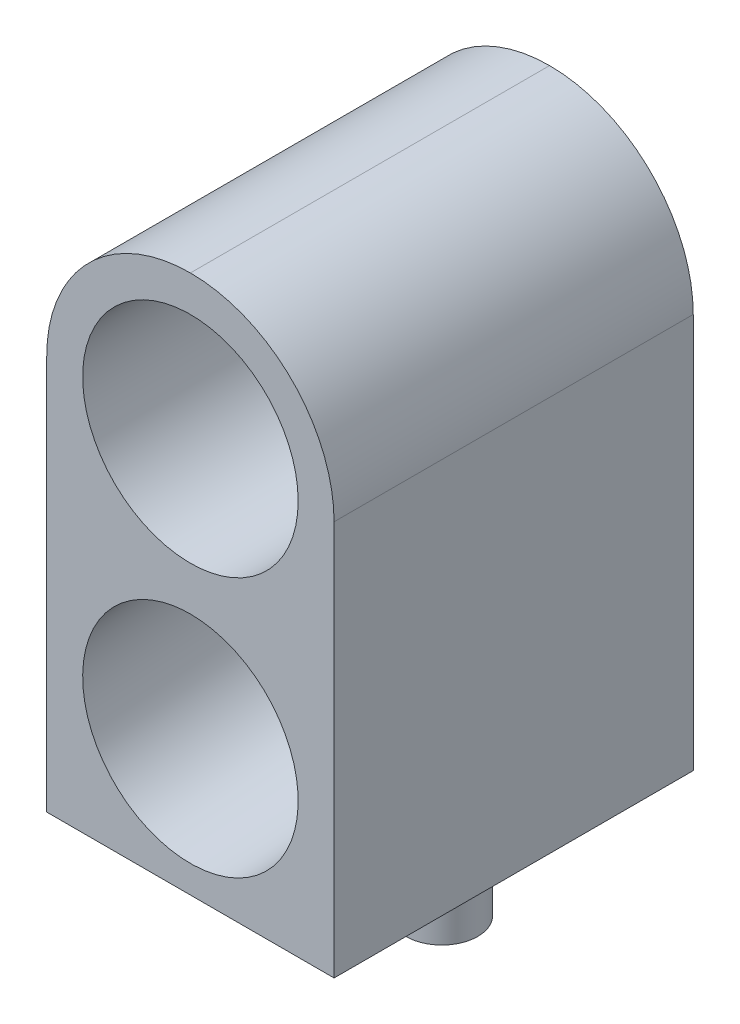
ISO-10303-21;
HEADER;
FILE_DESCRIPTION(('STEP AP214'),'2;1');
FILE_NAME('part.step','',(''),(''),'','','');
FILE_SCHEMA(('AUTOMOTIVE_DESIGN { 1 0 10303 214 1 1 1 1 }'));
ENDSEC;
DATA;
#1=APPLICATION_CONTEXT('core data for automotive mechanical design processes');
#2=APPLICATION_PROTOCOL_DEFINITION('international standard','automotive_design',2000,#1);
#3=PRODUCT_CONTEXT('',#1,'mechanical');
#4=PRODUCT('Part','Part','',(#3));
#5=PRODUCT_RELATED_PRODUCT_CATEGORY('part','',(#4));
#6=PRODUCT_DEFINITION_FORMATION('','',#4);
#7=PRODUCT_DEFINITION_CONTEXT('part definition',#1,'design');
#8=PRODUCT_DEFINITION('design','',#6,#7);
#9=PRODUCT_DEFINITION_SHAPE('','',#8);
#10=(LENGTH_UNIT() NAMED_UNIT(*) SI_UNIT(.MILLI.,.METRE.));
#11=(NAMED_UNIT(*) PLANE_ANGLE_UNIT() SI_UNIT($,.RADIAN.));
#12=(NAMED_UNIT(*) SI_UNIT($,.STERADIAN.) SOLID_ANGLE_UNIT());
#13=UNCERTAINTY_MEASURE_WITH_UNIT(LENGTH_MEASURE(1.E-05),#10,'distance_accuracy_value','');
#14=(GEOMETRIC_REPRESENTATION_CONTEXT(3) GLOBAL_UNCERTAINTY_ASSIGNED_CONTEXT((#13)) GLOBAL_UNIT_ASSIGNED_CONTEXT((#10,
#11,#12)) REPRESENTATION_CONTEXT('',''));
#15=CARTESIAN_POINT('',(0.,0.,0.));
#16=DIRECTION('',(0.,0.,1.));
#17=DIRECTION('',(1.,0.,0.));
#18=AXIS2_PLACEMENT_3D('',#15,#16,#17);
#19=CARTESIAN_POINT('',(3.99999999999999,-7.49999999999999,10.));
#20=DIRECTION('',(-1.,0.,0.));
#21=DIRECTION('',(0.,0.,1.));
#22=AXIS2_PLACEMENT_3D('',#19,#20,#21);
#23=PLANE('',#22);
#24=DIRECTION('',(0.,1.,0.));
#25=VECTOR('',#24,1.);
#26=CARTESIAN_POINT('',(3.99999999999999,-7.49999999999999,0.));
#27=LINE('',#26,#25);
#28=CARTESIAN_POINT('',(3.99999999999999,-7.49999999999999,0.));
#29=VERTEX_POINT('',#28);
#30=CARTESIAN_POINT('',(3.99999999999999,3.50000000000001,0.));
#31=VERTEX_POINT('',#30);
#32=EDGE_CURVE('E109',#29,#31,#27,.T.);
#33=ORIENTED_EDGE('',*,*,#32,.T.);
#34=DIRECTION('',(0.,0.,-1.));
#35=VECTOR('',#34,1.);
#36=CARTESIAN_POINT('',(3.99999999999999,3.50000000000001,10.));
#37=LINE('',#36,#35);
#38=CARTESIAN_POINT('',(3.99999999999999,3.50000000000001,10.));
#39=VERTEX_POINT('',#38);
#40=EDGE_CURVE('E119',#31,#39,#37,.F.);
#41=ORIENTED_EDGE('',*,*,#40,.T.);
#42=DIRECTION('',(0.,1.,0.));
#43=VECTOR('',#42,1.);
#44=CARTESIAN_POINT('',(3.99999999999999,-7.49999999999999,10.));
#45=LINE('',#44,#43);
#46=CARTESIAN_POINT('',(3.99999999999999,-7.49999999999999,10.));
#47=VERTEX_POINT('',#46);
#48=EDGE_CURVE('E90',#47,#39,#45,.T.);
#49=ORIENTED_EDGE('',*,*,#48,.F.);
#50=DIRECTION('',(0.,0.,-1.));
#51=VECTOR('',#50,1.);
#52=CARTESIAN_POINT('',(3.99999999999999,-7.49999999999999,10.));
#53=LINE('',#52,#51);
#54=EDGE_CURVE('E100',#47,#29,#53,.T.);
#55=ORIENTED_EDGE('',*,*,#54,.T.);
#56=EDGE_LOOP('',(#33,#41,#49,#55));
#57=FACE_BOUND('',#56,.T.);
#58=ADVANCED_FACE('F38',(#57),#23,.F.);
#59=CARTESIAN_POINT('',(-4.,-7.49999999999999,10.));
#60=DIRECTION('',(1.,0.,0.));
#61=DIRECTION('',(0.,0.,-1.));
#62=AXIS2_PLACEMENT_3D('',#59,#60,#61);
#63=PLANE('',#62);
#64=DIRECTION('',(0.,-1.,0.));
#65=VECTOR('',#64,1.);
#66=CARTESIAN_POINT('',(-4.,-7.49999999999999,10.));
#67=LINE('',#66,#65);
#68=CARTESIAN_POINT('',(-4.,3.50000000000001,10.));
#69=VERTEX_POINT('',#68);
#70=CARTESIAN_POINT('',(-4.,-7.49999999999999,10.));
#71=VERTEX_POINT('',#70);
#72=EDGE_CURVE('E82',#69,#71,#67,.T.);
#73=ORIENTED_EDGE('',*,*,#72,.F.);
#74=DIRECTION('',(0.,0.,-1.));
#75=VECTOR('',#74,1.);
#76=CARTESIAN_POINT('',(-4.,3.50000000000001,10.));
#77=LINE('',#76,#75);
#78=CARTESIAN_POINT('',(-4.,3.50000000000001,0.));
#79=VERTEX_POINT('',#78);
#80=EDGE_CURVE('E124',#69,#79,#77,.T.);
#81=ORIENTED_EDGE('',*,*,#80,.T.);
#82=DIRECTION('',(0.,-1.,0.));
#83=VECTOR('',#82,1.);
#84=CARTESIAN_POINT('',(-4.,-7.49999999999999,0.));
#85=LINE('',#84,#83);
#86=CARTESIAN_POINT('',(-4.,-7.49999999999999,0.));
#87=VERTEX_POINT('',#86);
#88=EDGE_CURVE('E96',#79,#87,#85,.T.);
#89=ORIENTED_EDGE('',*,*,#88,.T.);
#90=DIRECTION('',(0.,0.,-1.));
#91=VECTOR('',#90,1.);
#92=CARTESIAN_POINT('',(-4.,-7.49999999999999,10.));
#93=LINE('',#92,#91);
#94=EDGE_CURVE('E93',#71,#87,#93,.T.);
#95=ORIENTED_EDGE('',*,*,#94,.F.);
#96=EDGE_LOOP('',(#73,#81,#89,#95));
#97=FACE_BOUND('',#96,.T.);
#98=ADVANCED_FACE('F94',(#97),#63,.F.);
#99=CARTESIAN_POINT('',(-4.,-7.49999999999999,10.));
#100=DIRECTION('',(0.,1.,0.));
#101=DIRECTION('',(0.,0.,1.));
#102=AXIS2_PLACEMENT_3D('',#99,#100,#101);
#103=PLANE('',#102);
#104=CARTESIAN_POINT('',(1.99999999999999,-7.49999999999999,5.));
#105=DIRECTION('',(0.,1.,0.));
#106=DIRECTION('',(0.,0.,1.));
#107=AXIS2_PLACEMENT_3D('',#104,#105,#106);
#108=CIRCLE('',#107,1.);
#109=CARTESIAN_POINT('',(1.99999999999999,-7.49999999999999,6.));
#110=VERTEX_POINT('',#109);
#111=EDGE_CURVE('E11',#110,#110,#108,.F.);
#112=ORIENTED_EDGE('',*,*,#111,.F.);
#113=EDGE_LOOP('',(#112));
#114=FACE_BOUND('',#113,.T.);
#115=CARTESIAN_POINT('',(-2.,-7.49999999999999,5.));
#116=DIRECTION('',(0.,1.,0.));
#117=DIRECTION('',(0.,0.,1.));
#118=AXIS2_PLACEMENT_3D('',#115,#116,#117);
#119=CIRCLE('',#118,1.);
#120=CARTESIAN_POINT('',(-2.,-7.49999999999999,6.));
#121=VERTEX_POINT('',#120);
#122=EDGE_CURVE('E47',#121,#121,#119,.F.);
#123=ORIENTED_EDGE('',*,*,#122,.F.);
#124=EDGE_LOOP('',(#123));
#125=FACE_BOUND('',#124,.T.);
#126=DIRECTION('',(1.,0.,0.));
#127=VECTOR('',#126,1.);
#128=CARTESIAN_POINT('',(-4.,-7.49999999999999,0.));
#129=LINE('',#128,#127);
#130=EDGE_CURVE('E114',#87,#29,#129,.T.);
#131=ORIENTED_EDGE('',*,*,#130,.T.);
#132=ORIENTED_EDGE('',*,*,#54,.F.);
#133=DIRECTION('',(1.,0.,0.));
#134=VECTOR('',#133,1.);
#135=CARTESIAN_POINT('',(-4.,-7.49999999999999,10.));
#136=LINE('',#135,#134);
#137=EDGE_CURVE('E86',#71,#47,#136,.T.);
#138=ORIENTED_EDGE('',*,*,#137,.F.);
#139=ORIENTED_EDGE('',*,*,#94,.T.);
#140=EDGE_LOOP('',(#131,#132,#138,#139));
#141=FACE_BOUND('',#140,.T.);
#142=ADVANCED_FACE('F102',(#114,#125,#141),#103,.F.);
#143=CARTESIAN_POINT('',(0.,0.,10.));
#144=DIRECTION('',(0.,0.,-1.));
#145=DIRECTION('',(-1.,0.,0.));
#146=AXIS2_PLACEMENT_3D('',#143,#144,#145);
#147=PLANE('',#146);
#148=CARTESIAN_POINT('',(0.,-3.73075847941358,10.));
#149=DIRECTION('',(0.,0.,-1.));
#150=DIRECTION('',(0.,1.,0.));
#151=AXIS2_PLACEMENT_3D('',#148,#149,#150);
#152=ELLIPSE('',#151,3.00732569424352,3.);
#153=CARTESIAN_POINT('',(0.,-0.723432785170062,10.));
#154=VERTEX_POINT('',#153);
#155=EDGE_CURVE('E139',#154,#154,#152,.F.);
#156=ORIENTED_EDGE('',*,*,#155,.F.);
#157=EDGE_LOOP('',(#156));
#158=FACE_BOUND('',#157,.T.);
#159=CARTESIAN_POINT('',(0.,3.50000000000001,10.));
#160=DIRECTION('',(0.,0.,1.));
#161=DIRECTION('',(1.,0.,0.));
#162=AXIS2_PLACEMENT_3D('',#159,#160,#161);
#163=CIRCLE('',#162,3.);
#164=CARTESIAN_POINT('',(3.,3.50000000000001,10.));
#165=VERTEX_POINT('',#164);
#166=EDGE_CURVE('E133',#165,#165,#163,.T.);
#167=ORIENTED_EDGE('',*,*,#166,.F.);
#168=EDGE_LOOP('',(#167));
#169=FACE_BOUND('',#168,.T.);
#170=ORIENTED_EDGE('',*,*,#48,.T.);
#171=CARTESIAN_POINT('',(0.,3.50000000000001,10.));
#172=DIRECTION('',(0.,0.,-1.));
#173=DIRECTION('',(-1.,0.,0.));
#174=AXIS2_PLACEMENT_3D('',#171,#172,#173);
#175=CIRCLE('',#174,4.);
#176=CARTESIAN_POINT('',(0.,7.50000000000001,10.));
#177=VERTEX_POINT('',#176);
#178=EDGE_CURVE('E60',#39,#177,#175,.F.);
#179=ORIENTED_EDGE('',*,*,#178,.T.);
#180=CARTESIAN_POINT('',(0.,3.50000000000001,10.));
#181=DIRECTION('',(0.,0.,-1.));
#182=DIRECTION('',(-1.,0.,0.));
#183=AXIS2_PLACEMENT_3D('',#180,#181,#182);
#184=CIRCLE('',#183,4.);
#185=EDGE_CURVE('E55',#177,#69,#184,.F.);
#186=ORIENTED_EDGE('',*,*,#185,.T.);
#187=ORIENTED_EDGE('',*,*,#72,.T.);
#188=ORIENTED_EDGE('',*,*,#137,.T.);
#189=EDGE_LOOP('',(#170,#179,#186,#187,#188));
#190=FACE_BOUND('',#189,.T.);
#191=ADVANCED_FACE('F84',(#158,#169,#190),#147,.F.);
#192=CARTESIAN_POINT('',(0.,0.,0.));
#193=DIRECTION('',(0.,0.,-1.));
#194=DIRECTION('',(-1.,0.,0.));
#195=AXIS2_PLACEMENT_3D('',#192,#193,#194);
#196=PLANE('',#195);
#197=CARTESIAN_POINT('',(0.,-3.03149035997847,0.));
#198=DIRECTION('',(0.,0.,-1.));
#199=DIRECTION('',(0.,1.,0.));
#200=AXIS2_PLACEMENT_3D('',#197,#198,#199);
#201=ELLIPSE('',#200,3.00732569424352,3.);
#202=CARTESIAN_POINT('',(0.,-0.0241646657349534,0.));
#203=VERTEX_POINT('',#202);
#204=EDGE_CURVE('E42',#203,#203,#201,.F.);
#205=ORIENTED_EDGE('',*,*,#204,.T.);
#206=EDGE_LOOP('',(#205));
#207=FACE_BOUND('',#206,.T.);
#208=CARTESIAN_POINT('',(0.,3.50000000000001,0.));
#209=DIRECTION('',(0.,0.,-1.));
#210=DIRECTION('',(-1.,0.,0.));
#211=AXIS2_PLACEMENT_3D('',#208,#209,#210);
#212=CIRCLE('',#211,3.);
#213=CARTESIAN_POINT('',(3.,3.50000000000001,0.));
#214=VERTEX_POINT('',#213);
#215=EDGE_CURVE('E130',#214,#214,#212,.T.);
#216=ORIENTED_EDGE('',*,*,#215,.F.);
#217=EDGE_LOOP('',(#216));
#218=FACE_BOUND('',#217,.T.);
#219=CARTESIAN_POINT('',(0.,3.50000000000001,0.));
#220=DIRECTION('',(0.,0.,-1.));
#221=DIRECTION('',(-1.,0.,0.));
#222=AXIS2_PLACEMENT_3D('',#219,#220,#221);
#223=CIRCLE('',#222,4.);
#224=CARTESIAN_POINT('',(0.,7.50000000000001,0.));
#225=VERTEX_POINT('',#224);
#226=EDGE_CURVE('E99',#79,#225,#223,.T.);
#227=ORIENTED_EDGE('',*,*,#226,.T.);
#228=CARTESIAN_POINT('',(0.,3.50000000000001,0.));
#229=DIRECTION('',(0.,0.,-1.));
#230=DIRECTION('',(-1.,0.,0.));
#231=AXIS2_PLACEMENT_3D('',#228,#229,#230);
#232=CIRCLE('',#231,4.);
#233=EDGE_CURVE('E117',#225,#31,#232,.T.);
#234=ORIENTED_EDGE('',*,*,#233,.T.);
#235=ORIENTED_EDGE('',*,*,#32,.F.);
#236=ORIENTED_EDGE('',*,*,#130,.F.);
#237=ORIENTED_EDGE('',*,*,#88,.F.);
#238=EDGE_LOOP('',(#227,#234,#235,#236,#237));
#239=FACE_BOUND('',#238,.T.);
#240=ADVANCED_FACE('F157',(#207,#218,#239),#196,.T.);
#241=CARTESIAN_POINT('',(0.,3.50000000000001,10.));
#242=DIRECTION('',(0.,0.,-1.));
#243=DIRECTION('',(-1.,0.,0.));
#244=AXIS2_PLACEMENT_3D('',#241,#242,#243);
#245=CYLINDRICAL_SURFACE('',#244,4.);
#246=ORIENTED_EDGE('',*,*,#80,.F.);
#247=ORIENTED_EDGE('',*,*,#185,.F.);
#248=DIRECTION('',(0.,0.,-1.));
#249=VECTOR('',#248,1.);
#250=CARTESIAN_POINT('',(0.,7.50000000000001,10.));
#251=LINE('',#250,#249);
#252=EDGE_CURVE('E112',#225,#177,#251,.F.);
#253=ORIENTED_EDGE('',*,*,#252,.F.);
#254=ORIENTED_EDGE('',*,*,#226,.F.);
#255=EDGE_LOOP('',(#246,#247,#253,#254));
#256=FACE_BOUND('',#255,.T.);
#257=ADVANCED_FACE('F40',(#256),#245,.T.);
#258=CARTESIAN_POINT('',(0.,3.50000000000001,10.));
#259=DIRECTION('',(0.,0.,-1.));
#260=DIRECTION('',(-1.,0.,0.));
#261=AXIS2_PLACEMENT_3D('',#258,#259,#260);
#262=CYLINDRICAL_SURFACE('',#261,4.);
#263=ORIENTED_EDGE('',*,*,#178,.F.);
#264=ORIENTED_EDGE('',*,*,#40,.F.);
#265=ORIENTED_EDGE('',*,*,#233,.F.);
#266=ORIENTED_EDGE('',*,*,#252,.T.);
#267=EDGE_LOOP('',(#263,#264,#265,#266));
#268=FACE_BOUND('',#267,.T.);
#269=ADVANCED_FACE('F152',(#268),#262,.T.);
#270=CARTESIAN_POINT('',(-2.,-9.49999999999999,5.));
#271=DIRECTION('',(0.,1.,0.));
#272=DIRECTION('',(0.,0.,1.));
#273=AXIS2_PLACEMENT_3D('',#270,#271,#272);
#274=CYLINDRICAL_SURFACE('',#273,1.);
#275=CARTESIAN_POINT('',(-2.,-9.49999999999999,5.));
#276=DIRECTION('',(0.,-1.,0.));
#277=DIRECTION('',(0.,0.,-1.));
#278=AXIS2_PLACEMENT_3D('',#275,#276,#277);
#279=CIRCLE('',#278,1.);
#280=CARTESIAN_POINT('',(-2.,-9.49999999999999,4.));
#281=VERTEX_POINT('',#280);
#282=EDGE_CURVE('E128',#281,#281,#279,.T.);
#283=ORIENTED_EDGE('',*,*,#282,.F.);
#284=EDGE_LOOP('',(#283));
#285=FACE_BOUND('',#284,.T.);
#286=ORIENTED_EDGE('',*,*,#122,.T.);
#287=EDGE_LOOP('',(#286));
#288=FACE_BOUND('',#287,.T.);
#289=ADVANCED_FACE('F177',(#285,#288),#274,.T.);
#290=CARTESIAN_POINT('',(-2.,-9.49999999999999,5.));
#291=DIRECTION('',(0.,-1.,0.));
#292=DIRECTION('',(0.,0.,-1.));
#293=AXIS2_PLACEMENT_3D('',#290,#291,#292);
#294=PLANE('',#293);
#295=ORIENTED_EDGE('',*,*,#282,.T.);
#296=EDGE_LOOP('',(#295));
#297=FACE_BOUND('',#296,.T.);
#298=ADVANCED_FACE('F181',(#297),#294,.T.);
#299=CARTESIAN_POINT('',(1.99999999999999,-9.49999999999999,5.));
#300=DIRECTION('',(0.,1.,0.));
#301=DIRECTION('',(0.,0.,1.));
#302=AXIS2_PLACEMENT_3D('',#299,#300,#301);
#303=CYLINDRICAL_SURFACE('',#302,1.);
#304=CARTESIAN_POINT('',(1.99999999999999,-9.49999999999999,5.));
#305=DIRECTION('',(0.,-1.,0.));
#306=DIRECTION('',(0.,0.,-1.));
#307=AXIS2_PLACEMENT_3D('',#304,#305,#306);
#308=CIRCLE('',#307,1.);
#309=CARTESIAN_POINT('',(1.99999999999999,-9.49999999999999,4.));
#310=VERTEX_POINT('',#309);
#311=EDGE_CURVE('E132',#310,#310,#308,.T.);
#312=ORIENTED_EDGE('',*,*,#311,.F.);
#313=EDGE_LOOP('',(#312));
#314=FACE_BOUND('',#313,.T.);
#315=ORIENTED_EDGE('',*,*,#111,.T.);
#316=EDGE_LOOP('',(#315));
#317=FACE_BOUND('',#316,.T.);
#318=ADVANCED_FACE('F187',(#314,#317),#303,.T.);
#319=CARTESIAN_POINT('',(1.99999999999999,-9.49999999999999,5.));
#320=DIRECTION('',(0.,-1.,0.));
#321=DIRECTION('',(0.,0.,-1.));
#322=AXIS2_PLACEMENT_3D('',#319,#320,#321);
#323=PLANE('',#322);
#324=ORIENTED_EDGE('',*,*,#311,.T.);
#325=EDGE_LOOP('',(#324));
#326=FACE_BOUND('',#325,.T.);
#327=ADVANCED_FACE('F195',(#326),#323,.T.);
#328=CARTESIAN_POINT('',(0.,3.50000000000001,-5.));
#329=DIRECTION('',(0.,0.,1.));
#330=DIRECTION('',(1.,0.,0.));
#331=AXIS2_PLACEMENT_3D('',#328,#329,#330);
#332=CYLINDRICAL_SURFACE('',#331,3.);
#333=CARTESIAN_POINT('',(3.,3.50000000000001,0.));
#334=CARTESIAN_POINT('',(3.,3.50000000000001,0.104166666666668));
#335=CARTESIAN_POINT('',(3.,3.50000000000001,0.208333333333334));
#336=CARTESIAN_POINT('',(3.,3.50000000000001,0.416666666666668));
#337=CARTESIAN_POINT('',(3.,3.50000000000001,0.520833333333334));
#338=CARTESIAN_POINT('',(3.,3.50000000000001,0.729166666666667));
#339=CARTESIAN_POINT('',(3.,3.50000000000001,0.833333333333334));
#340=CARTESIAN_POINT('',(3.,3.50000000000001,1.04166666666667));
#341=CARTESIAN_POINT('',(3.,3.50000000000001,1.14583333333333));
#342=CARTESIAN_POINT('',(3.,3.50000000000001,1.35416666666667));
#343=CARTESIAN_POINT('',(3.,3.50000000000001,1.45833333333333));
#344=CARTESIAN_POINT('',(3.,3.50000000000001,1.66666666666667));
#345=CARTESIAN_POINT('',(3.,3.50000000000001,1.77083333333333));
#346=CARTESIAN_POINT('',(3.,3.50000000000001,1.97916666666667));
#347=CARTESIAN_POINT('',(3.,3.50000000000001,2.08333333333333));
#348=CARTESIAN_POINT('',(3.,3.50000000000001,2.29166666666667));
#349=CARTESIAN_POINT('',(3.,3.50000000000001,2.39583333333333));
#350=CARTESIAN_POINT('',(3.,3.50000000000001,2.60416666666667));
#351=CARTESIAN_POINT('',(3.,3.50000000000001,2.70833333333333));
#352=CARTESIAN_POINT('',(3.,3.50000000000001,2.91666666666667));
#353=CARTESIAN_POINT('',(3.,3.50000000000001,3.02083333333333));
#354=CARTESIAN_POINT('',(3.,3.50000000000001,3.22916666666667));
#355=CARTESIAN_POINT('',(3.,3.50000000000001,3.33333333333333));
#356=CARTESIAN_POINT('',(3.,3.50000000000001,3.54166666666667));
#357=CARTESIAN_POINT('',(3.,3.50000000000001,3.64583333333333));
#358=CARTESIAN_POINT('',(3.,3.50000000000001,3.85416666666667));
#359=CARTESIAN_POINT('',(3.,3.50000000000001,3.95833333333333));
#360=CARTESIAN_POINT('',(3.,3.50000000000001,4.16666666666667));
#361=CARTESIAN_POINT('',(3.,3.50000000000001,4.27083333333333));
#362=CARTESIAN_POINT('',(3.,3.50000000000001,4.47916666666667));
#363=CARTESIAN_POINT('',(3.,3.50000000000001,4.58333333333333));
#364=CARTESIAN_POINT('',(3.,3.50000000000001,4.79166666666667));
#365=CARTESIAN_POINT('',(3.,3.50000000000001,4.89583333333333));
#366=CARTESIAN_POINT('',(3.,3.50000000000001,5.10416666666667));
#367=CARTESIAN_POINT('',(3.,3.50000000000001,5.20833333333333));
#368=CARTESIAN_POINT('',(3.,3.50000000000001,5.41666666666667));
#369=CARTESIAN_POINT('',(3.,3.50000000000001,5.52083333333333));
#370=CARTESIAN_POINT('',(3.,3.50000000000001,5.72916666666667));
#371=CARTESIAN_POINT('',(3.,3.50000000000001,5.83333333333333));
#372=CARTESIAN_POINT('',(3.,3.50000000000001,6.04166666666667));
#373=CARTESIAN_POINT('',(3.,3.50000000000001,6.14583333333333));
#374=CARTESIAN_POINT('',(3.,3.50000000000001,6.35416666666667));
#375=CARTESIAN_POINT('',(3.,3.50000000000001,6.45833333333333));
#376=CARTESIAN_POINT('',(3.,3.50000000000001,6.66666666666667));
#377=CARTESIAN_POINT('',(3.,3.50000000000001,6.77083333333333));
#378=CARTESIAN_POINT('',(3.,3.50000000000001,6.97916666666667));
#379=CARTESIAN_POINT('',(3.,3.50000000000001,7.08333333333333));
#380=CARTESIAN_POINT('',(3.,3.50000000000001,7.29166666666667));
#381=CARTESIAN_POINT('',(3.,3.50000000000001,7.39583333333333));
#382=CARTESIAN_POINT('',(3.,3.50000000000001,7.60416666666667));
#383=CARTESIAN_POINT('',(3.,3.50000000000001,7.70833333333333));
#384=CARTESIAN_POINT('',(3.,3.50000000000001,7.91666666666667));
#385=CARTESIAN_POINT('',(3.,3.50000000000001,8.02083333333333));
#386=CARTESIAN_POINT('',(3.,3.50000000000001,8.22916666666667));
#387=CARTESIAN_POINT('',(3.,3.50000000000001,8.33333333333333));
#388=CARTESIAN_POINT('',(3.,3.50000000000001,8.54166666666667));
#389=CARTESIAN_POINT('',(3.,3.50000000000001,8.64583333333333));
#390=CARTESIAN_POINT('',(3.,3.50000000000001,8.85416666666667));
#391=CARTESIAN_POINT('',(3.,3.50000000000001,8.95833333333333));
#392=CARTESIAN_POINT('',(3.,3.50000000000001,9.16666666666667));
#393=CARTESIAN_POINT('',(3.,3.50000000000001,9.27083333333333));
#394=CARTESIAN_POINT('',(3.,3.50000000000001,9.47916666666667));
#395=CARTESIAN_POINT('',(3.,3.50000000000001,9.58333333333333));
#396=CARTESIAN_POINT('',(3.,3.50000000000001,9.79166666666667));
#397=CARTESIAN_POINT('',(3.,3.50000000000001,9.89583333333333));
#398=CARTESIAN_POINT('',(3.,3.50000000000001,10.));
#399=B_SPLINE_CURVE_WITH_KNOTS('',3,(#333,#334,#335,#336,#337,#338,#339,#340,#341,#342,#343,
#344,#345,#346,#347,#348,#349,#350,#351,#352,#353,#354,#355,#356,#357,#358,#359,#360,#361,#362,
#363,#364,#365,#366,#367,#368,#369,#370,#371,#372,#373,#374,#375,#376,#377,#378,#379,#380,#381,
#382,#383,#384,#385,#386,#387,#388,#389,#390,#391,#392,#393,#394,#395,#396,#397,#398),
.UNSPECIFIED.,.F.,.F.,(4,2,2,2,2,2,2,2,2,2,2,2,2,2,2,2,2,2,2,2,2,2,2,2,2,2,2,2,2,2,2,2,4),(0.,
0.3125,0.625,0.9375,1.25,1.5625,1.875,2.1875,2.5,2.8125,3.125,3.4375,3.75,4.0625,4.375,4.6875,
5.,5.3125,5.625,5.9375,6.25,6.5625,6.875,7.1875,7.5,7.8125,8.125,8.4375,8.75,9.0625,9.375,
9.6875,10.),.UNSPECIFIED.);
#400=EDGE_CURVE('BSEAM199',#214,#165,#399,.T.);
#401=ORIENTED_EDGE('',*,*,#215,.T.);
#402=ORIENTED_EDGE('',*,*,#166,.T.);
#403=ORIENTED_EDGE('',*,*,#400,.T.);
#404=ORIENTED_EDGE('',*,*,#400,.F.);
#405=EDGE_LOOP('',(#401,#403,#402,#404));
#406=FACE_BOUND('',#405,.T.);
#407=ADVANCED_FACE('F199',(#406),#332,.F.);
#408=CARTESIAN_POINT('',(0.,-4.40133421101647,19.5896797375034));
#409=DIRECTION('',(0.,0.0697564737441258,-0.997564050259824));
#410=DIRECTION('',(0.,0.997564050259824,0.0697564737441258));
#411=AXIS2_PLACEMENT_3D('',#408,#409,#410);
#412=CYLINDRICAL_SURFACE('',#411,3.);
#413=ORIENTED_EDGE('',*,*,#204,.F.);
#414=EDGE_LOOP('',(#413));
#415=FACE_BOUND('',#414,.T.);
#416=ORIENTED_EDGE('',*,*,#155,.T.);
#417=EDGE_LOOP('',(#416));
#418=FACE_BOUND('',#417,.T.);
#419=ADVANCED_FACE('F203',(#415,#418),#412,.F.);
#420=CLOSED_SHELL('',(#58,#98,#142,#191,#240,#257,#269,#289,#298,#318,#327,#407,#419));
#421=MANIFOLD_SOLID_BREP('B2',#420);
#422=ADVANCED_BREP_SHAPE_REPRESENTATION('',(#18,#421),#14);
#423=SHAPE_DEFINITION_REPRESENTATION(#9,#422);
ENDSEC;
END-ISO-10303-21;
